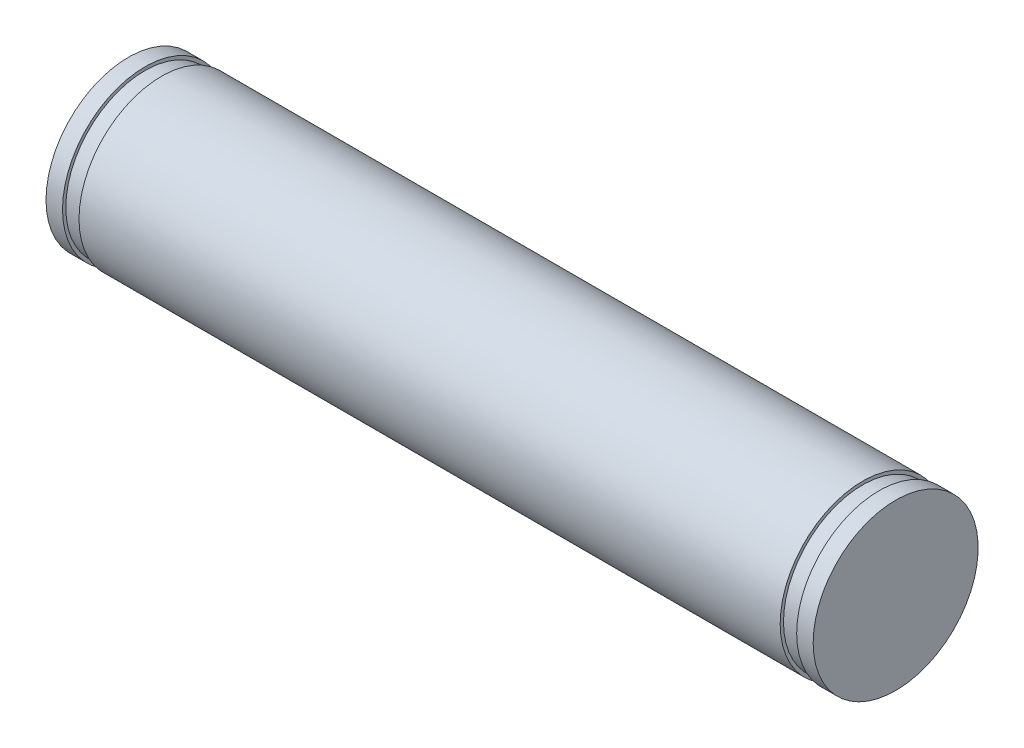
ISO-10303-21;
HEADER;
FILE_DESCRIPTION(('STEP AP214'),'2;1');
FILE_NAME('part.step','',(''),(''),'','','');
FILE_SCHEMA(('AUTOMOTIVE_DESIGN { 1 0 10303 214 1 1 1 1 }'));
ENDSEC;
DATA;
#1=APPLICATION_CONTEXT('core data for automotive mechanical design processes');
#2=APPLICATION_PROTOCOL_DEFINITION('international standard','automotive_design',2000,#1);
#3=PRODUCT_CONTEXT('',#1,'mechanical');
#4=PRODUCT('Part','Part','',(#3));
#5=PRODUCT_RELATED_PRODUCT_CATEGORY('part','',(#4));
#6=PRODUCT_DEFINITION_FORMATION('','',#4);
#7=PRODUCT_DEFINITION_CONTEXT('part definition',#1,'design');
#8=PRODUCT_DEFINITION('design','',#6,#7);
#9=PRODUCT_DEFINITION_SHAPE('','',#8);
#10=(LENGTH_UNIT() NAMED_UNIT(*) SI_UNIT(.MILLI.,.METRE.));
#11=(NAMED_UNIT(*) PLANE_ANGLE_UNIT() SI_UNIT($,.RADIAN.));
#12=(NAMED_UNIT(*) SI_UNIT($,.STERADIAN.) SOLID_ANGLE_UNIT());
#13=UNCERTAINTY_MEASURE_WITH_UNIT(LENGTH_MEASURE(1.E-05),#10,'distance_accuracy_value','');
#14=(GEOMETRIC_REPRESENTATION_CONTEXT(3) GLOBAL_UNCERTAINTY_ASSIGNED_CONTEXT((#13)) GLOBAL_UNIT_ASSIGNED_CONTEXT((#10,
#11,#12)) REPRESENTATION_CONTEXT('',''));
#15=CARTESIAN_POINT('',(0.,0.,0.));
#16=DIRECTION('',(0.,0.,1.));
#17=DIRECTION('',(1.,0.,0.));
#18=AXIS2_PLACEMENT_3D('',#15,#16,#17);
#19=CARTESIAN_POINT('',(-23.25,0.,0.));
#20=DIRECTION('',(1.,0.,0.));
#21=DIRECTION('',(0.,0.,-1.));
#22=AXIS2_PLACEMENT_3D('',#19,#20,#21);
#23=PLANE('',#22);
#24=CARTESIAN_POINT('',(-23.25,0.,0.));
#25=DIRECTION('',(-1.,0.,0.));
#26=DIRECTION('',(0.,0.,1.));
#27=AXIS2_PLACEMENT_3D('',#24,#25,#26);
#28=CIRCLE('',#27,5.);
#29=CARTESIAN_POINT('',(-23.25,0.,5.));
#30=VERTEX_POINT('',#29);
#31=EDGE_CURVE('E10',#30,#30,#28,.T.);
#32=ORIENTED_EDGE('',*,*,#31,.T.);
#33=EDGE_LOOP('',(#32));
#34=FACE_BOUND('',#33,.T.);
#35=ADVANCED_FACE('F34',(#34),#23,.F.);
#36=CARTESIAN_POINT('',(-23.25,0.,0.));
#37=DIRECTION('',(-1.,0.,0.));
#38=DIRECTION('',(0.,0.,1.));
#39=AXIS2_PLACEMENT_3D('',#36,#37,#38);
#40=CYLINDRICAL_SURFACE('',#39,5.);
#41=ORIENTED_EDGE('',*,*,#31,.F.);
#42=EDGE_LOOP('',(#41));
#43=FACE_BOUND('',#42,.T.);
#44=CARTESIAN_POINT('',(-22.25,0.,0.));
#45=DIRECTION('',(-1.,0.,0.));
#46=DIRECTION('',(0.,0.,1.));
#47=AXIS2_PLACEMENT_3D('',#44,#45,#46);
#48=CIRCLE('',#47,5.);
#49=CARTESIAN_POINT('',(-22.25,0.,5.));
#50=VERTEX_POINT('',#49);
#51=EDGE_CURVE('E40',#50,#50,#48,.T.);
#52=ORIENTED_EDGE('',*,*,#51,.T.);
#53=EDGE_LOOP('',(#52));
#54=FACE_BOUND('',#53,.T.);
#55=ADVANCED_FACE('F84',(#43,#54),#40,.T.);
#56=CARTESIAN_POINT('',(-22.25,0.,-5.));
#57=DIRECTION('',(-1.,0.,0.));
#58=DIRECTION('',(0.,0.,1.));
#59=AXIS2_PLACEMENT_3D('',#56,#57,#58);
#60=PLANE('',#59);
#61=ORIENTED_EDGE('',*,*,#51,.F.);
#62=EDGE_LOOP('',(#61));
#63=FACE_BOUND('',#62,.T.);
#64=CARTESIAN_POINT('',(-22.25,0.,0.));
#65=DIRECTION('',(-1.,0.,0.));
#66=DIRECTION('',(0.,0.,1.));
#67=AXIS2_PLACEMENT_3D('',#64,#65,#66);
#68=CIRCLE('',#67,4.8);
#69=CARTESIAN_POINT('',(-22.25,0.,4.8));
#70=VERTEX_POINT('',#69);
#71=EDGE_CURVE('E44',#70,#70,#68,.T.);
#72=ORIENTED_EDGE('',*,*,#71,.T.);
#73=EDGE_LOOP('',(#72));
#74=FACE_BOUND('',#73,.T.);
#75=ADVANCED_FACE('F88',(#63,#74),#60,.F.);
#76=CARTESIAN_POINT('',(-23.25,0.,0.));
#77=DIRECTION('',(-1.,0.,0.));
#78=DIRECTION('',(0.,0.,1.));
#79=AXIS2_PLACEMENT_3D('',#76,#77,#78);
#80=CYLINDRICAL_SURFACE('',#79,4.8);
#81=ORIENTED_EDGE('',*,*,#71,.F.);
#82=EDGE_LOOP('',(#81));
#83=FACE_BOUND('',#82,.T.);
#84=CARTESIAN_POINT('',(-21.25,0.,0.));
#85=DIRECTION('',(-1.,0.,0.));
#86=DIRECTION('',(0.,0.,1.));
#87=AXIS2_PLACEMENT_3D('',#84,#85,#86);
#88=CIRCLE('',#87,4.8);
#89=CARTESIAN_POINT('',(-21.25,0.,4.8));
#90=VERTEX_POINT('',#89);
#91=EDGE_CURVE('E48',#90,#90,#88,.T.);
#92=ORIENTED_EDGE('',*,*,#91,.T.);
#93=EDGE_LOOP('',(#92));
#94=FACE_BOUND('',#93,.T.);
#95=ADVANCED_FACE('F93',(#83,#94),#80,.T.);
#96=CARTESIAN_POINT('',(-21.25,0.,-4.8));
#97=DIRECTION('',(1.,0.,0.));
#98=DIRECTION('',(0.,0.,-1.));
#99=AXIS2_PLACEMENT_3D('',#96,#97,#98);
#100=PLANE('',#99);
#101=ORIENTED_EDGE('',*,*,#91,.F.);
#102=EDGE_LOOP('',(#101));
#103=FACE_BOUND('',#102,.T.);
#104=CARTESIAN_POINT('',(-21.25,0.,0.));
#105=DIRECTION('',(-1.,0.,0.));
#106=DIRECTION('',(0.,0.,1.));
#107=AXIS2_PLACEMENT_3D('',#104,#105,#106);
#108=CIRCLE('',#107,5.);
#109=CARTESIAN_POINT('',(-21.25,0.,5.));
#110=VERTEX_POINT('',#109);
#111=EDGE_CURVE('E53',#110,#110,#108,.T.);
#112=ORIENTED_EDGE('',*,*,#111,.T.);
#113=EDGE_LOOP('',(#112));
#114=FACE_BOUND('',#113,.T.);
#115=ADVANCED_FACE('F99',(#103,#114),#100,.F.);
#116=CARTESIAN_POINT('',(-23.25,0.,0.));
#117=DIRECTION('',(-1.,0.,0.));
#118=DIRECTION('',(0.,0.,1.));
#119=AXIS2_PLACEMENT_3D('',#116,#117,#118);
#120=CYLINDRICAL_SURFACE('',#119,5.);
#121=ORIENTED_EDGE('',*,*,#111,.F.);
#122=EDGE_LOOP('',(#121));
#123=FACE_BOUND('',#122,.T.);
#124=CARTESIAN_POINT('',(21.25,0.,0.));
#125=DIRECTION('',(-1.,0.,0.));
#126=DIRECTION('',(0.,0.,1.));
#127=AXIS2_PLACEMENT_3D('',#124,#125,#126);
#128=CIRCLE('',#127,4.99999999999999);
#129=CARTESIAN_POINT('',(21.25,0.,4.99999999999998));
#130=VERTEX_POINT('',#129);
#131=EDGE_CURVE('E56',#130,#130,#128,.T.);
#132=ORIENTED_EDGE('',*,*,#131,.T.);
#133=EDGE_LOOP('',(#132));
#134=FACE_BOUND('',#133,.T.);
#135=ADVANCED_FACE('F103',(#123,#134),#120,.T.);
#136=CARTESIAN_POINT('',(21.25,0.,-5.));
#137=DIRECTION('',(-1.,0.,0.));
#138=DIRECTION('',(0.,0.,1.));
#139=AXIS2_PLACEMENT_3D('',#136,#137,#138);
#140=PLANE('',#139);
#141=ORIENTED_EDGE('',*,*,#131,.F.);
#142=EDGE_LOOP('',(#141));
#143=FACE_BOUND('',#142,.T.);
#144=CARTESIAN_POINT('',(21.25,0.,0.));
#145=DIRECTION('',(-1.,0.,0.));
#146=DIRECTION('',(0.,0.,1.));
#147=AXIS2_PLACEMENT_3D('',#144,#145,#146);
#148=CIRCLE('',#147,4.79999999999999);
#149=CARTESIAN_POINT('',(21.25,0.,4.79999999999998));
#150=VERTEX_POINT('',#149);
#151=EDGE_CURVE('E59',#150,#150,#148,.T.);
#152=ORIENTED_EDGE('',*,*,#151,.T.);
#153=EDGE_LOOP('',(#152));
#154=FACE_BOUND('',#153,.T.);
#155=ADVANCED_FACE('F107',(#143,#154),#140,.F.);
#156=CARTESIAN_POINT('',(-23.25,0.,0.));
#157=DIRECTION('',(-1.,0.,0.));
#158=DIRECTION('',(0.,0.,1.));
#159=AXIS2_PLACEMENT_3D('',#156,#157,#158);
#160=CYLINDRICAL_SURFACE('',#159,4.79999999999999);
#161=ORIENTED_EDGE('',*,*,#151,.F.);
#162=EDGE_LOOP('',(#161));
#163=FACE_BOUND('',#162,.T.);
#164=CARTESIAN_POINT('',(22.25,0.,0.));
#165=DIRECTION('',(-1.,0.,0.));
#166=DIRECTION('',(0.,0.,1.));
#167=AXIS2_PLACEMENT_3D('',#164,#165,#166);
#168=CIRCLE('',#167,4.79999999999999);
#169=CARTESIAN_POINT('',(22.25,0.,4.79999999999998));
#170=VERTEX_POINT('',#169);
#171=EDGE_CURVE('E62',#170,#170,#168,.T.);
#172=ORIENTED_EDGE('',*,*,#171,.T.);
#173=EDGE_LOOP('',(#172));
#174=FACE_BOUND('',#173,.T.);
#175=ADVANCED_FACE('F111',(#163,#174),#160,.T.);
#176=CARTESIAN_POINT('',(22.25,0.,-4.8));
#177=DIRECTION('',(1.,0.,0.));
#178=DIRECTION('',(0.,0.,-1.));
#179=AXIS2_PLACEMENT_3D('',#176,#177,#178);
#180=PLANE('',#179);
#181=ORIENTED_EDGE('',*,*,#171,.F.);
#182=EDGE_LOOP('',(#181));
#183=FACE_BOUND('',#182,.T.);
#184=CARTESIAN_POINT('',(22.25,0.,0.));
#185=DIRECTION('',(-1.,0.,0.));
#186=DIRECTION('',(0.,0.,1.));
#187=AXIS2_PLACEMENT_3D('',#184,#185,#186);
#188=CIRCLE('',#187,4.99999999999999);
#189=CARTESIAN_POINT('',(22.25,0.,4.99999999999998));
#190=VERTEX_POINT('',#189);
#191=EDGE_CURVE('E65',#190,#190,#188,.T.);
#192=ORIENTED_EDGE('',*,*,#191,.T.);
#193=EDGE_LOOP('',(#192));
#194=FACE_BOUND('',#193,.T.);
#195=ADVANCED_FACE('F80',(#183,#194),#180,.F.);
#196=CARTESIAN_POINT('',(-23.25,0.,0.));
#197=DIRECTION('',(-1.,0.,0.));
#198=DIRECTION('',(0.,0.,1.));
#199=AXIS2_PLACEMENT_3D('',#196,#197,#198);
#200=CYLINDRICAL_SURFACE('',#199,5.);
#201=ORIENTED_EDGE('',*,*,#191,.F.);
#202=EDGE_LOOP('',(#201));
#203=FACE_BOUND('',#202,.T.);
#204=CARTESIAN_POINT('',(23.25,0.,0.));
#205=DIRECTION('',(-1.,0.,0.));
#206=DIRECTION('',(0.,0.,1.));
#207=AXIS2_PLACEMENT_3D('',#204,#205,#206);
#208=CIRCLE('',#207,5.);
#209=CARTESIAN_POINT('',(23.25,0.,4.99999999999999));
#210=VERTEX_POINT('',#209);
#211=EDGE_CURVE('E68',#210,#210,#208,.T.);
#212=ORIENTED_EDGE('',*,*,#211,.T.);
#213=EDGE_LOOP('',(#212));
#214=FACE_BOUND('',#213,.T.);
#215=ADVANCED_FACE('F72',(#203,#214),#200,.T.);
#216=CARTESIAN_POINT('',(23.25,0.,-5.00000000000001));
#217=DIRECTION('',(-1.,0.,0.));
#218=DIRECTION('',(0.,0.,1.));
#219=AXIS2_PLACEMENT_3D('',#216,#217,#218);
#220=PLANE('',#219);
#221=ORIENTED_EDGE('',*,*,#211,.F.);
#222=EDGE_LOOP('',(#221));
#223=FACE_BOUND('',#222,.T.);
#224=ADVANCED_FACE('F74',(#223),#220,.F.);
#225=CLOSED_SHELL('',(#35,#55,#75,#95,#115,#135,#155,#175,#195,#215,#224));
#226=MANIFOLD_SOLID_BREP('B2',#225);
#227=ADVANCED_BREP_SHAPE_REPRESENTATION('',(#18,#226),#14);
#228=SHAPE_DEFINITION_REPRESENTATION(#9,#227);
ENDSEC;
END-ISO-10303-21;
